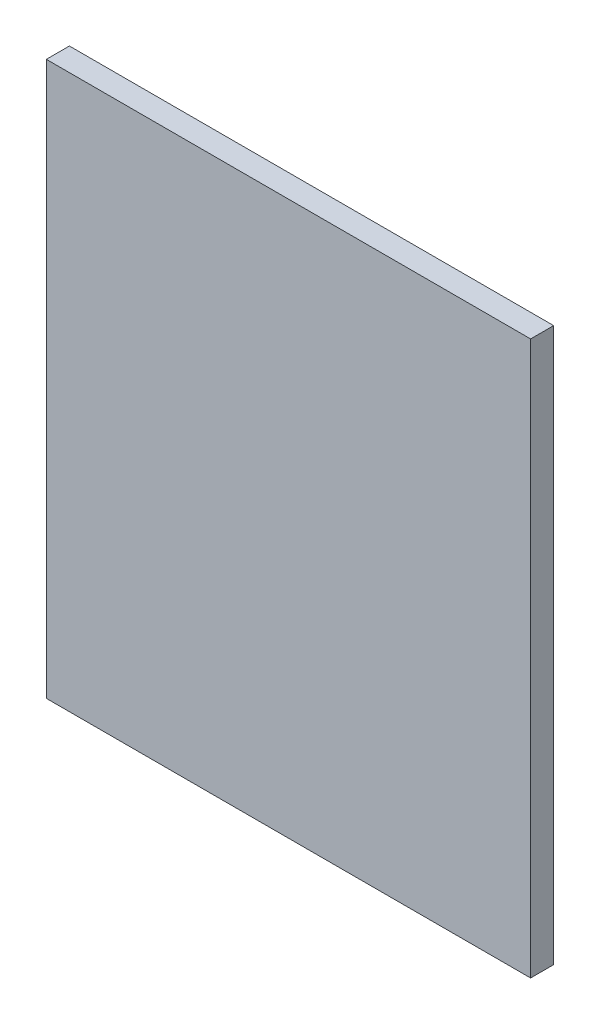
ISO-10303-21;
HEADER;
FILE_DESCRIPTION(('STEP AP214'),'2;1');
FILE_NAME('part.step','',(''),(''),'','','');
FILE_SCHEMA(('AUTOMOTIVE_DESIGN { 1 0 10303 214 1 1 1 1 }'));
ENDSEC;
DATA;
#1=APPLICATION_CONTEXT('core data for automotive mechanical design processes');
#2=APPLICATION_PROTOCOL_DEFINITION('international standard','automotive_design',2000,#1);
#3=PRODUCT_CONTEXT('',#1,'mechanical');
#4=PRODUCT('Part','Part','',(#3));
#5=PRODUCT_RELATED_PRODUCT_CATEGORY('part','',(#4));
#6=PRODUCT_DEFINITION_FORMATION('','',#4);
#7=PRODUCT_DEFINITION_CONTEXT('part definition',#1,'design');
#8=PRODUCT_DEFINITION('design','',#6,#7);
#9=PRODUCT_DEFINITION_SHAPE('','',#8);
#10=(LENGTH_UNIT() NAMED_UNIT(*) SI_UNIT(.MILLI.,.METRE.));
#11=(NAMED_UNIT(*) PLANE_ANGLE_UNIT() SI_UNIT($,.RADIAN.));
#12=(NAMED_UNIT(*) SI_UNIT($,.STERADIAN.) SOLID_ANGLE_UNIT());
#13=UNCERTAINTY_MEASURE_WITH_UNIT(LENGTH_MEASURE(1.E-05),#10,'distance_accuracy_value','');
#14=(GEOMETRIC_REPRESENTATION_CONTEXT(3) GLOBAL_UNCERTAINTY_ASSIGNED_CONTEXT((#13)) GLOBAL_UNIT_ASSIGNED_CONTEXT((#10,
#11,#12)) REPRESENTATION_CONTEXT('',''));
#15=CARTESIAN_POINT('',(0.,0.,0.));
#16=DIRECTION('',(0.,0.,1.));
#17=DIRECTION('',(1.,0.,0.));
#18=AXIS2_PLACEMENT_3D('',#15,#16,#17);
#19=CARTESIAN_POINT('',(-52.5,120.,5.));
#20=DIRECTION('',(1.,0.,0.));
#21=DIRECTION('',(0.,1.,0.));
#22=AXIS2_PLACEMENT_3D('',#19,#20,#21);
#23=PLANE('',#22);
#24=DIRECTION('',(0.,-1.,0.));
#25=VECTOR('',#24,1.);
#26=CARTESIAN_POINT('',(-52.5,120.,0.));
#27=LINE('',#26,#25);
#28=CARTESIAN_POINT('',(-52.5,120.,0.));
#29=VERTEX_POINT('',#28);
#30=CARTESIAN_POINT('',(-52.5,0.,0.));
#31=VERTEX_POINT('',#30);
#32=EDGE_CURVE('E100',#29,#31,#27,.T.);
#33=ORIENTED_EDGE('',*,*,#32,.T.);
#34=DIRECTION('',(0.,0.,-1.));
#35=VECTOR('',#34,1.);
#36=CARTESIAN_POINT('',(-52.5,0.,5.));
#37=LINE('',#36,#35);
#38=CARTESIAN_POINT('',(-52.5,0.,5.));
#39=VERTEX_POINT('',#38);
#40=EDGE_CURVE('E11',#39,#31,#37,.T.);
#41=ORIENTED_EDGE('',*,*,#40,.F.);
#42=DIRECTION('',(0.,-1.,0.));
#43=VECTOR('',#42,1.);
#44=CARTESIAN_POINT('',(-52.5,120.,5.));
#45=LINE('',#44,#43);
#46=CARTESIAN_POINT('',(-52.5,120.,5.));
#47=VERTEX_POINT('',#46);
#48=EDGE_CURVE('E88',#47,#39,#45,.T.);
#49=ORIENTED_EDGE('',*,*,#48,.F.);
#50=DIRECTION('',(0.,0.,-1.));
#51=VECTOR('',#50,1.);
#52=CARTESIAN_POINT('',(-52.5,120.,5.));
#53=LINE('',#52,#51);
#54=EDGE_CURVE('E96',#47,#29,#53,.T.);
#55=ORIENTED_EDGE('',*,*,#54,.T.);
#56=EDGE_LOOP('',(#33,#41,#49,#55));
#57=FACE_BOUND('',#56,.T.);
#58=ADVANCED_FACE('F37',(#57),#23,.F.);
#59=CARTESIAN_POINT('',(-52.5,0.,5.));
#60=DIRECTION('',(0.,1.,0.));
#61=DIRECTION('',(-1.,0.,0.));
#62=AXIS2_PLACEMENT_3D('',#59,#60,#61);
#63=PLANE('',#62);
#64=DIRECTION('',(1.,0.,0.));
#65=VECTOR('',#64,1.);
#66=CARTESIAN_POINT('',(-52.5,0.,0.));
#67=LINE('',#66,#65);
#68=CARTESIAN_POINT('',(52.5,0.,0.));
#69=VERTEX_POINT('',#68);
#70=EDGE_CURVE('E92',#31,#69,#67,.T.);
#71=ORIENTED_EDGE('',*,*,#70,.T.);
#72=DIRECTION('',(0.,0.,-1.));
#73=VECTOR('',#72,1.);
#74=CARTESIAN_POINT('',(52.5,0.,5.));
#75=LINE('',#74,#73);
#76=CARTESIAN_POINT('',(52.5,0.,5.));
#77=VERTEX_POINT('',#76);
#78=EDGE_CURVE('E45',#77,#69,#75,.T.);
#79=ORIENTED_EDGE('',*,*,#78,.F.);
#80=DIRECTION('',(1.,0.,0.));
#81=VECTOR('',#80,1.);
#82=CARTESIAN_POINT('',(-52.5,0.,5.));
#83=LINE('',#82,#81);
#84=EDGE_CURVE('E83',#39,#77,#83,.T.);
#85=ORIENTED_EDGE('',*,*,#84,.F.);
#86=ORIENTED_EDGE('',*,*,#40,.T.);
#87=EDGE_LOOP('',(#71,#79,#85,#86));
#88=FACE_BOUND('',#87,.T.);
#89=ADVANCED_FACE('F91',(#88),#63,.F.);
#90=CARTESIAN_POINT('',(52.5,120.,5.));
#91=DIRECTION('',(-1.,0.,0.));
#92=DIRECTION('',(0.,-1.,0.));
#93=AXIS2_PLACEMENT_3D('',#90,#91,#92);
#94=PLANE('',#93);
#95=DIRECTION('',(0.,1.,0.));
#96=VECTOR('',#95,1.);
#97=CARTESIAN_POINT('',(52.5,120.,0.));
#98=LINE('',#97,#96);
#99=CARTESIAN_POINT('',(52.5,120.,0.));
#100=VERTEX_POINT('',#99);
#101=EDGE_CURVE('E70',#69,#100,#98,.T.);
#102=ORIENTED_EDGE('',*,*,#101,.T.);
#103=DIRECTION('',(0.,0.,-1.));
#104=VECTOR('',#103,1.);
#105=CARTESIAN_POINT('',(52.5,120.,5.));
#106=LINE('',#105,#104);
#107=CARTESIAN_POINT('',(52.5,120.,5.));
#108=VERTEX_POINT('',#107);
#109=EDGE_CURVE('E93',#108,#100,#106,.T.);
#110=ORIENTED_EDGE('',*,*,#109,.F.);
#111=DIRECTION('',(0.,1.,0.));
#112=VECTOR('',#111,1.);
#113=CARTESIAN_POINT('',(52.5,120.,5.));
#114=LINE('',#113,#112);
#115=EDGE_CURVE('E86',#77,#108,#114,.T.);
#116=ORIENTED_EDGE('',*,*,#115,.F.);
#117=ORIENTED_EDGE('',*,*,#78,.T.);
#118=EDGE_LOOP('',(#102,#110,#116,#117));
#119=FACE_BOUND('',#118,.T.);
#120=ADVANCED_FACE('F94',(#119),#94,.F.);
#121=CARTESIAN_POINT('',(-52.5,120.,5.));
#122=DIRECTION('',(0.,-1.,0.));
#123=DIRECTION('',(1.,0.,0.));
#124=AXIS2_PLACEMENT_3D('',#121,#122,#123);
#125=PLANE('',#124);
#126=DIRECTION('',(-1.,0.,0.));
#127=VECTOR('',#126,1.);
#128=CARTESIAN_POINT('',(-52.5,120.,0.));
#129=LINE('',#128,#127);
#130=EDGE_CURVE('E76',#100,#29,#129,.T.);
#131=ORIENTED_EDGE('',*,*,#130,.T.);
#132=ORIENTED_EDGE('',*,*,#54,.F.);
#133=DIRECTION('',(-1.,0.,0.));
#134=VECTOR('',#133,1.);
#135=CARTESIAN_POINT('',(-52.5,120.,5.));
#136=LINE('',#135,#134);
#137=EDGE_CURVE('E53',#108,#47,#136,.T.);
#138=ORIENTED_EDGE('',*,*,#137,.F.);
#139=ORIENTED_EDGE('',*,*,#109,.T.);
#140=EDGE_LOOP('',(#131,#132,#138,#139));
#141=FACE_BOUND('',#140,.T.);
#142=ADVANCED_FACE('F107',(#141),#125,.F.);
#143=CARTESIAN_POINT('',(0.,0.,5.));
#144=DIRECTION('',(0.,0.,1.));
#145=DIRECTION('',(1.,0.,0.));
#146=AXIS2_PLACEMENT_3D('',#143,#144,#145);
#147=PLANE('',#146);
#148=ORIENTED_EDGE('',*,*,#48,.T.);
#149=ORIENTED_EDGE('',*,*,#84,.T.);
#150=ORIENTED_EDGE('',*,*,#115,.T.);
#151=ORIENTED_EDGE('',*,*,#137,.T.);
#152=EDGE_LOOP('',(#148,#149,#150,#151));
#153=FACE_BOUND('',#152,.T.);
#154=ADVANCED_FACE('F84',(#153),#147,.T.);
#155=CARTESIAN_POINT('',(0.,0.,0.));
#156=DIRECTION('',(0.,0.,1.));
#157=DIRECTION('',(1.,0.,0.));
#158=AXIS2_PLACEMENT_3D('',#155,#156,#157);
#159=PLANE('',#158);
#160=ORIENTED_EDGE('',*,*,#32,.F.);
#161=ORIENTED_EDGE('',*,*,#130,.F.);
#162=ORIENTED_EDGE('',*,*,#101,.F.);
#163=ORIENTED_EDGE('',*,*,#70,.F.);
#164=EDGE_LOOP('',(#160,#161,#162,#163));
#165=FACE_BOUND('',#164,.T.);
#166=ADVANCED_FACE('F110',(#165),#159,.F.);
#167=CLOSED_SHELL('',(#58,#89,#120,#142,#154,#166));
#168=MANIFOLD_SOLID_BREP('B2',#167);
#169=ADVANCED_BREP_SHAPE_REPRESENTATION('',(#18,#168),#14);
#170=SHAPE_DEFINITION_REPRESENTATION(#9,#169);
ENDSEC;
END-ISO-10303-21;
